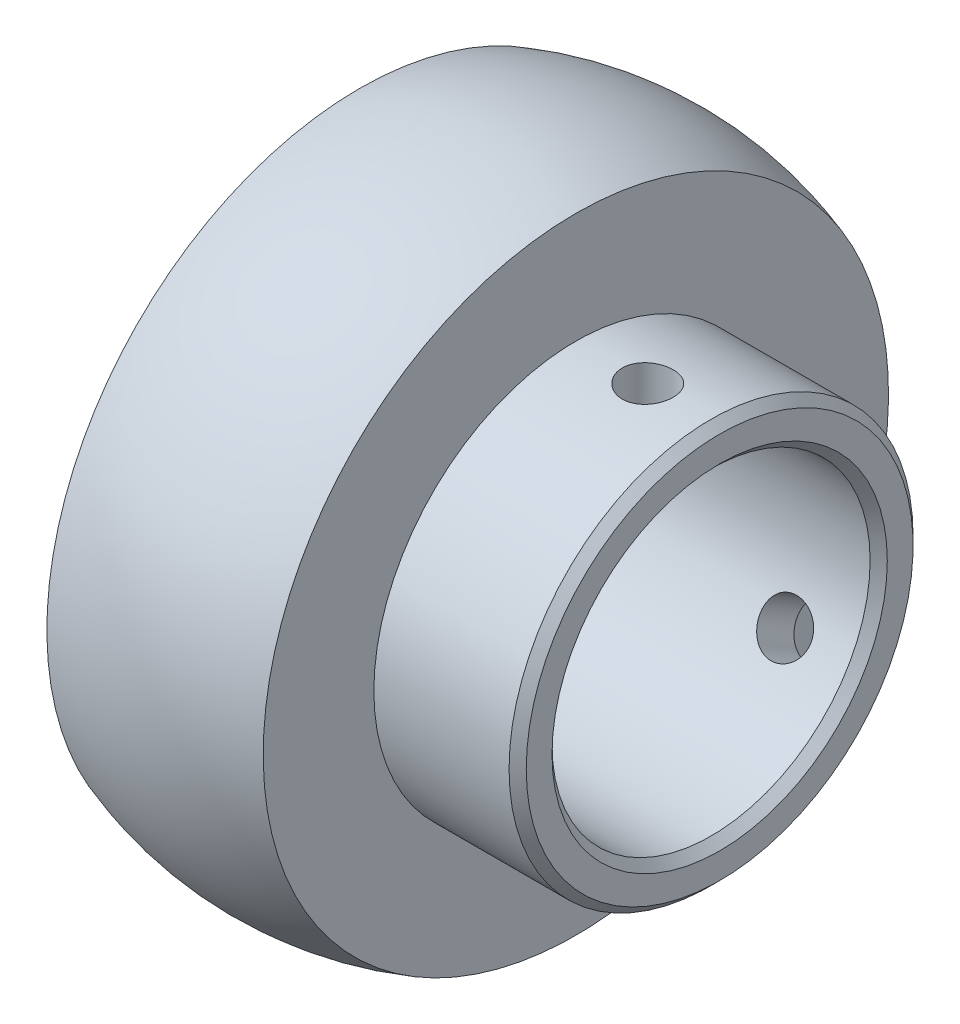
ISO-10303-21;
HEADER;
FILE_DESCRIPTION(('STEP AP214'),'2;1');
FILE_NAME('part.step','',(''),(''),'','','');
FILE_SCHEMA(('AUTOMOTIVE_DESIGN { 1 0 10303 214 1 1 1 1 }'));
ENDSEC;
DATA;
#1=APPLICATION_CONTEXT('core data for automotive mechanical design processes');
#2=APPLICATION_PROTOCOL_DEFINITION('international standard','automotive_design',2000,#1);
#3=PRODUCT_CONTEXT('',#1,'mechanical');
#4=PRODUCT('Part','Part','',(#3));
#5=PRODUCT_RELATED_PRODUCT_CATEGORY('part','',(#4));
#6=PRODUCT_DEFINITION_FORMATION('','',#4);
#7=PRODUCT_DEFINITION_CONTEXT('part definition',#1,'design');
#8=PRODUCT_DEFINITION('design','',#6,#7);
#9=PRODUCT_DEFINITION_SHAPE('','',#8);
#10=(LENGTH_UNIT() NAMED_UNIT(*) SI_UNIT(.MILLI.,.METRE.));
#11=(NAMED_UNIT(*) PLANE_ANGLE_UNIT() SI_UNIT($,.RADIAN.));
#12=(NAMED_UNIT(*) SI_UNIT($,.STERADIAN.) SOLID_ANGLE_UNIT());
#13=UNCERTAINTY_MEASURE_WITH_UNIT(LENGTH_MEASURE(1.E-05),#10,'distance_accuracy_value','');
#14=(GEOMETRIC_REPRESENTATION_CONTEXT(3) GLOBAL_UNCERTAINTY_ASSIGNED_CONTEXT((#13)) GLOBAL_UNIT_ASSIGNED_CONTEXT((#10,
#11,#12)) REPRESENTATION_CONTEXT('',''));
#15=CARTESIAN_POINT('',(0.,0.,0.));
#16=DIRECTION('',(0.,0.,1.));
#17=DIRECTION('',(1.,0.,0.));
#18=AXIS2_PLACEMENT_3D('',#15,#16,#17);
#19=CARTESIAN_POINT('',(-1000.,0.,0.));
#20=DIRECTION('',(-1.,0.,0.));
#21=DIRECTION('',(0.,0.,1.));
#22=AXIS2_PLACEMENT_3D('',#19,#20,#21);
#23=CYLINDRICAL_SURFACE('',#22,15.875);
#24=CARTESIAN_POINT('',(19.1250000000001,0.,0.));
#25=DIRECTION('',(-1.,0.,0.));
#26=DIRECTION('',(0.,0.,1.));
#27=AXIS2_PLACEMENT_3D('',#24,#25,#26);
#28=CIRCLE('',#27,15.875);
#29=CARTESIAN_POINT('',(19.1250000000001,0.,15.875));
#30=VERTEX_POINT('',#29);
#31=EDGE_CURVE('E53',#30,#30,#28,.T.);
#32=ORIENTED_EDGE('',*,*,#31,.T.);
#33=EDGE_LOOP('',(#32));
#34=FACE_BOUND('',#33,.T.);
#35=CARTESIAN_POINT('',(8.49999999999995,0.,0.));
#36=DIRECTION('',(-1.,0.,0.));
#37=DIRECTION('',(0.,0.,1.));
#38=AXIS2_PLACEMENT_3D('',#35,#36,#37);
#39=CIRCLE('',#38,15.875);
#40=CARTESIAN_POINT('',(8.49999999999995,0.,15.875));
#41=VERTEX_POINT('',#40);
#42=EDGE_CURVE('E174',#41,#41,#39,.T.);
#43=ORIENTED_EDGE('',*,*,#42,.F.);
#44=EDGE_LOOP('',(#43));
#45=FACE_BOUND('',#44,.T.);
#46=CARTESIAN_POINT('',(14.15,15.748511834456,-2.));
#47=CARTESIAN_POINT('',(14.0381384494105,15.7485134523924,-1.99999524855553));
#48=CARTESIAN_POINT('',(13.9262071639896,15.7497165319805,-1.99058357543387));
#49=CARTESIAN_POINT('',(13.7054601779164,15.7543969866903,-1.95318765248393));
#50=CARTESIAN_POINT('',(13.5966478486121,15.7578767326131,-1.92518404153693));
#51=CARTESIAN_POINT('',(13.3853667618518,15.7667102668491,-1.85144335928852));
#52=CARTESIAN_POINT('',(13.2828937338898,15.7720627770236,-1.80571838031894));
#53=CARTESIAN_POINT('',(13.0870942906262,15.7840372074871,-1.69785890210504));
#54=CARTESIAN_POINT('',(12.9937663263942,15.7906589122448,-1.63572718833439));
#55=CARTESIAN_POINT('',(12.8183569548713,15.8044677726734,-1.49643975257389));
#56=CARTESIAN_POINT('',(12.7363350370349,15.8116576278481,-1.41920937281938));
#57=CARTESIAN_POINT('',(12.5863799880055,15.8257684025693,-1.25207761624602));
#58=CARTESIAN_POINT('',(12.5184475602959,15.8326893086733,-1.16217560711322));
#59=CARTESIAN_POINT('',(12.3983862459514,15.8455100304133,-0.971878431845148));
#60=CARTESIAN_POINT('',(12.3463112313292,15.8514063367107,-0.871449020506815));
#61=CARTESIAN_POINT('',(12.2597880428856,15.861483827628,-0.663183648289304));
#62=CARTESIAN_POINT('',(12.225339204944,15.8656650768667,-0.555347966637749));
#63=CARTESIAN_POINT('',(12.1752240789684,15.871822327582,-0.335939673673915));
#64=CARTESIAN_POINT('',(12.1594588594635,15.8738099406767,-0.224389990404355));
#65=CARTESIAN_POINT('',(12.1468518632201,15.8753956248804,-0.00021178234898757));
#66=CARTESIAN_POINT('',(12.1500093309459,15.874993791394,0.112416699183834));
#67=CARTESIAN_POINT('',(12.1750788381399,15.8718552492625,0.334882227912962));
#68=CARTESIAN_POINT('',(12.1968844777027,15.8691317872949,0.444731478434195));
#69=CARTESIAN_POINT('',(12.2584649968302,15.8616708761223,0.659198925647051));
#70=CARTESIAN_POINT('',(12.2982402225595,15.8569333881195,0.763817021523035));
#71=CARTESIAN_POINT('',(12.3947438371768,15.8459539257529,0.965181562038033));
#72=CARTESIAN_POINT('',(12.4515182261247,15.8397078781804,1.06190573011397));
#73=CARTESIAN_POINT('',(12.580375082548,15.8264099980585,1.24449377001974));
#74=CARTESIAN_POINT('',(12.6524582631447,15.8193581279791,1.3303571356292));
#75=CARTESIAN_POINT('',(12.8104823372397,15.8051799073183,1.48941139298715));
#76=CARTESIAN_POINT('',(12.896515964835,15.7980533795464,1.56251016630964));
#77=CARTESIAN_POINT('',(13.0796803168561,15.7845773489401,1.6932441669862));
#78=CARTESIAN_POINT('',(13.1768110770642,15.7782278486113,1.75087934447661));
#79=CARTESIAN_POINT('',(13.3794950958505,15.767024855595,1.84905563258412));
#80=CARTESIAN_POINT('',(13.48505200393,15.7621720156096,1.88958928795802));
#81=CARTESIAN_POINT('',(13.7015489574573,15.7545244711852,1.95232983937358));
#82=CARTESIAN_POINT('',(13.812488738947,15.7517296659355,1.97453763309476));
#83=CARTESIAN_POINT('',(14.0357884646264,15.7485330768205,1.99987390904939));
#84=CARTESIAN_POINT('',(14.1481334716722,15.7481150291289,2.00313206459948));
#85=CARTESIAN_POINT('',(14.3717677431275,15.7496762675728,1.9908187933542));
#86=CARTESIAN_POINT('',(14.4830570303518,15.7516555017817,1.97524777440968));
#87=CARTESIAN_POINT('',(14.7010316905911,15.7577734487156,1.92582736892158));
#88=CARTESIAN_POINT('',(14.8077315411069,15.7619047337565,1.89204083826573));
#89=CARTESIAN_POINT('',(15.0139515611222,15.7718552621376,1.80721321308999));
#90=CARTESIAN_POINT('',(15.1134714744447,15.7776745656684,1.75617150328219));
#91=CARTESIAN_POINT('',(15.3030931029367,15.7903843738882,1.63796384277904));
#92=CARTESIAN_POINT('',(15.3931414520774,15.7972804554653,1.57071289494593));
#93=CARTESIAN_POINT('',(15.5607191543688,15.8113493175124,1.4221158475027));
#94=CARTESIAN_POINT('',(15.6382480124774,15.8185221089103,1.34076919078765));
#95=CARTESIAN_POINT('',(15.7790418620887,15.832386185117,1.16572322850878));
#96=CARTESIAN_POINT('',(15.8422216187734,15.8390744397561,1.07195509209945));
#97=CARTESIAN_POINT('',(15.9519339047026,15.8511704760989,0.875062416244103));
#98=CARTESIAN_POINT('',(15.9984667740237,15.8565782839599,0.771938067988556));
#99=CARTESIAN_POINT('',(16.0734238017248,15.865490667394,0.559542905322648));
#100=CARTESIAN_POINT('',(16.1018971240815,15.8690004062531,0.450289667150804));
#101=CARTESIAN_POINT('',(16.1400867106037,15.8737426471462,0.228505918573019));
#102=CARTESIAN_POINT('',(16.1498038346512,15.8749752535757,0.115975558647537));
#103=CARTESIAN_POINT('',(16.1501889446016,15.8750238364982,-0.108336054482698));
#104=CARTESIAN_POINT('',(16.1409883222722,15.8738564817455,-0.22011710124838));
#105=CARTESIAN_POINT('',(16.1040775134633,15.8692694583507,-0.440530726050264));
#106=CARTESIAN_POINT('',(16.0763673412841,15.8658497914489,-0.549163306518875));
#107=CARTESIAN_POINT('',(16.0032654793059,15.8571406768498,-0.760178414550271));
#108=CARTESIAN_POINT('',(15.9578801856119,15.8518519055903,-0.862563187525339));
#109=CARTESIAN_POINT('',(15.8507300216539,15.8399900350749,-1.05828412902422));
#110=CARTESIAN_POINT('',(15.7889649442034,15.8334169195738,-1.15162018307121));
#111=CARTESIAN_POINT('',(15.6503227483021,15.819665508229,-1.32726531992085));
#112=CARTESIAN_POINT('',(15.5733478855294,15.8124834793164,-1.409496962418));
#113=CARTESIAN_POINT('',(15.406674317316,15.7983535709128,-1.55992739126403));
#114=CARTESIAN_POINT('',(15.3169726036155,15.7914057472631,-1.62812285049826));
#115=CARTESIAN_POINT('',(15.1269876848541,15.7785018490831,-1.74877432119565));
#116=CARTESIAN_POINT('',(15.0266643583141,15.7725497711358,-1.80116755245359));
#117=CARTESIAN_POINT('',(14.8186239377274,15.7623581237431,-1.88828825110165));
#118=CARTESIAN_POINT('',(14.7109150171444,15.7581166958373,-1.92303490054296));
#119=CARTESIAN_POINT('',(14.5272093339912,15.7528546374031,-1.96557298626346));
#120=CARTESIAN_POINT('',(14.4523705151306,15.7512342157326,-1.97846450858597));
#121=CARTESIAN_POINT('',(14.3016984842213,15.7490622697562,-1.99567959346033));
#122=CARTESIAN_POINT('',(14.2258652798894,15.7485107371602,-2.00000322246261));
#123=CARTESIAN_POINT('',(14.15,15.748511834456,-2.));
#124=B_SPLINE_CURVE_WITH_KNOTS('',3,(#46,#47,#48,#49,#50,#51,#52,#53,#54,#55,#56,#57,#58,#59,
#60,#61,#62,#63,#64,#65,#66,#67,#68,#69,#70,#71,#72,#73,#74,#75,#76,#77,#78,#79,#80,#81,#82,#83,
#84,#85,#86,#87,#88,#89,#90,#91,#92,#93,#94,#95,#96,#97,#98,#99,#100,#101,#102,#103,#104,#105,
#106,#107,#108,#109,#110,#111,#112,#113,#114,#115,#116,#117,#118,#119,#120,#121,#122,#123),
.UNSPECIFIED.,.T.,.F.,(4,2,2,2,2,2,2,2,2,2,2,2,2,2,2,2,2,2,2,2,2,2,2,2,2,2,2,2,2,2,2,2,2,2,2,2,
2,2,4),(0.,0.335307497787281,0.670964724181042,1.00639331401727,1.3417649926233,1.6788389426269,
2.01592971856978,2.35415322700654,2.69236399089647,3.02877578039733,3.36517413790664,
3.69966583329214,4.03416397257172,4.36957557888719,4.70500281293066,5.04275878217702,
5.38051584053288,5.71841998905328,6.0563075845925,6.39188025276989,6.7274456523788,
7.06186046611993,7.39628720573523,7.73250728023294,8.068740646194,8.40692186658587,
8.74509617793433,9.08234587179594,9.41958010400552,9.75448001475644,10.0893796667669,
10.4241582409128,10.7589410498446,11.0959497112757,11.43303816494,11.7714487023612,
12.109490591772,12.3369002274259,12.5643080993407),.UNSPECIFIED.);
#125=CARTESIAN_POINT('',(14.15,15.748511834456,-2.));
#126=VERTEX_POINT('',#125);
#127=EDGE_CURVE('E104',#126,#126,#124,.T.);
#128=ORIENTED_EDGE('',*,*,#127,.F.);
#129=EDGE_LOOP('',(#128));
#130=FACE_BOUND('',#129,.T.);
#131=CARTESIAN_POINT('',(14.15,-9.60630672479692,-12.6386113204387));
#132=CARTESIAN_POINT('',(14.0381384494105,-9.60630341889354,-12.638615097335));
#133=CARTESIAN_POINT('',(13.9262071639896,-9.5987542106721,-12.6443628313819));
#134=CARTESIAN_POINT('',(13.7054601779164,-9.56870861875439,-12.6671141855368));
#135=CARTESIAN_POINT('',(13.5966478486121,-9.54619665323797,-12.6841295393781));
#136=CARTESIAN_POINT('',(13.3853667618518,-9.48675211623649,-12.728649945556));
#137=CARTESIAN_POINT('',(13.2828937338898,-9.44982937794857,-12.7561478448259));
#138=CARTESIAN_POINT('',(13.0870942906262,-9.36240754500815,-12.8204477449101));
#139=CARTESIAN_POINT('',(12.9937663263942,-9.31191075488093,-12.8572481663319));
#140=CARTESIAN_POINT('',(12.8183569548713,-9.19818872729866,-12.9388507081407));
#141=CARTESIAN_POINT('',(12.7363350370349,-9.13490018407467,-12.9836924952487));
#142=CARTESIAN_POINT('',(12.5863799880055,-8.99721522446362,-13.079478662911));
#143=CARTESIAN_POINT('',(12.5184475602959,-8.92281825375535,-13.1304233479807));
#144=CARTESIAN_POINT('',(12.3983862459514,-8.76442642657481,-13.2366750063365));
#145=CARTESIAN_POINT('',(12.3463112313292,-8.68040015821739,-13.2919960630477));
#146=CARTESIAN_POINT('',(12.2597880428856,-8.50507580060703,-13.4048561122972));
#147=CARTESIAN_POINT('',(12.225339204944,-8.41377798548173,-13.4623950211832));
#148=CARTESIAN_POINT('',(12.1752240789684,-8.22684345533171,-13.577431503202));
#149=CARTESIAN_POINT('',(12.1594588594635,-8.13123240238352,-13.6349276682697));
#150=CARTESIAN_POINT('',(12.1468518632201,-7.93788122133455,-13.7483900151002));
#151=CARTESIAN_POINT('',(12.1500093309459,-7.84014117839427,-13.8043562578593));
#152=CARTESIAN_POINT('',(12.1750788381399,-7.64591110798279,-13.9128709650072));
#153=CARTESIAN_POINT('',(12.1968844777027,-7.5494171354609,-13.9654370030176));
#154=CARTESIAN_POINT('',(12.2584649968302,-7.35995242230348,-14.0662093880132));
#155=CARTESIAN_POINT('',(12.2982402225595,-7.26698174957789,-14.1144156509906));
#156=CARTESIAN_POINT('',(12.3947438371768,-7.08710521088725,-14.2055894279188));
#157=CARTESIAN_POINT('',(12.4515182261247,-7.00021660038728,-14.2485422760856));
#158=CARTESIAN_POINT('',(12.580375082548,-6.83544177934075,-14.3283199940365));
#159=CARTESIAN_POINT('',(12.6524582631447,-6.75755598842882,-14.3651445782083));
#160=CARTESIAN_POINT('',(12.8104823372397,-6.61272185064637,-14.4323930076146));
#161=CARTESIAN_POINT('',(12.896515964835,-6.54585319207769,-14.4627706401846));
#162=CARTESIAN_POINT('',(13.0796803168561,-6.42589621105025,-14.5164670556756));
#163=CARTESIAN_POINT('',(13.1768110770642,-6.37280793302751,-14.5397858158347));
#164=CARTESIAN_POINT('',(13.3794950958505,-6.282183276969,-14.5791718833379));
#165=CARTESIAN_POINT('',(13.48505200393,-6.24465368171429,-14.5952360283171));
#166=CARTESIAN_POINT('',(13.7015489574573,-6.18649499812876,-14.6199833362767));
#167=CARTESIAN_POINT('',(13.812488738947,-6.16586508197935,-14.6286668607924));
#168=CARTESIAN_POINT('',(14.0357884646263,-6.14232492880783,-14.6385666713907));
#169=CARTESIAN_POINT('',(14.1481334716722,-6.1392942594862,-14.6398337092449));
#170=CARTESIAN_POINT('',(14.3717677431275,-6.15073848441024,-14.635029145776));
#171=CARTESIAN_POINT('',(14.4830570303518,-6.16521299948345,-14.6289577034087));
#172=CARTESIAN_POINT('',(14.7010316905911,-6.21107129956844,-14.6095457981284));
#173=CARTESIAN_POINT('',(14.8077315411069,-6.2423969359426,-14.5962303305962));
#174=CARTESIAN_POINT('',(15.0139515611222,-6.32083507847805,-14.5624339283674));
#175=CARTESIAN_POINT('',(15.1134714744447,-6.36794814758958,-14.5419527381535));
#176=CARTESIAN_POINT('',(15.3030931029367,-6.47667388861715,-14.4938559246975));
#177=CARTESIAN_POINT('',(15.3931414520774,-6.53836295865772,-14.4662026326133));
#178=CARTESIAN_POINT('',(15.5607191543688,-6.67408620769451,-14.4040881008268));
#179=CARTESIAN_POINT('',(15.6382480124774,-6.74812087462159,-14.3696265920359));
#180=CARTESIAN_POINT('',(15.7790418620887,-6.90664716288837,-14.2941102530915));
#181=CARTESIAN_POINT('',(15.8422216187734,-6.9911968784039,-14.2530183833113));
#182=CARTESIAN_POINT('',(15.9519339047026,-7.16775895568514,-14.1650475201415));
#183=CARTESIAN_POINT('',(15.9984667740237,-7.25977116495366,-14.1181686450002));
#184=CARTESIAN_POINT('',(16.0734238017248,-7.44816696318029,-14.0196894141294));
#185=CARTESIAN_POINT('',(16.1018971240815,-7.54453791231237,-13.9681023180561));
#186=CARTESIAN_POINT('',(16.1400867106037,-7.73897939317382,-13.8613173448515));
#187=CARTESIAN_POINT('',(16.1498038346512,-7.83704984678106,-13.8061196333696));
#188=CARTESIAN_POINT('',(16.1501889446016,-8.03133369357695,-13.6940059008495));
#189=CARTESIAN_POINT('',(16.1409883222722,-8.12755524236128,-13.6371044185956));
#190=CARTESIAN_POINT('',(16.1040775134633,-8.31614552908257,-13.5229251274071));
#191=CARTESIAN_POINT('',(16.0763673412841,-8.40851426999612,-13.4656473187633));
#192=CARTESIAN_POINT('',(16.0032654793059,-8.58690415683407,-13.3525974502603));
#193=CARTESIAN_POINT('',(15.9578801856119,-8.67292758556142,-13.2968248535072));
#194=CARTESIAN_POINT('',(15.8507300216539,-8.83649595769439,-13.1886917015551));
#195=CARTESIAN_POINT('',(15.7889649442034,-8.91404079383754,-13.1363311895257));
#196=CARTESIAN_POINT('',(15.6503227483021,-9.05927823872809,-13.0365995495383));
#197=CARTESIAN_POINT('',(15.5733478855294,-9.12690191566926,-12.9892639088007));
#198=CARTESIAN_POINT('',(15.406674317316,-9.25011353435032,-12.9018118347471));
#199=CARTESIAN_POINT('',(15.3169726036155,-9.30569862264504,-12.8616971133483));
#200=CARTESIAN_POINT('',(15.1269876848541,-9.40373391218295,-12.7901962743679));
#201=CARTESIAN_POINT('',(15.0266643583141,-9.44613174246502,-12.7588450080312));
#202=CARTESIAN_POINT('',(14.8186239377274,-9.51648465699334,-12.7064584331587));
#203=CARTESIAN_POINT('',(14.7109150171444,-9.54445542415301,-12.6854119241233));
#204=CARTESIAN_POINT('',(14.5272093339912,-9.57866345779823,-12.6595858049829));
#205=CARTESIAN_POINT('',(14.4523705151306,-9.58901763278771,-12.6517367174901));
#206=CARTESIAN_POINT('',(14.3016984842213,-9.60284036062899,-12.6412482146616));
#207=CARTESIAN_POINT('',(14.2258652798894,-9.60630896688354,-12.6386087589214));
#208=CARTESIAN_POINT('',(14.15,-9.60630672479692,-12.6386113204387));
#209=B_SPLINE_CURVE_WITH_KNOTS('',3,(#131,#132,#133,#134,#135,#136,#137,#138,#139,#140,#141,
#142,#143,#144,#145,#146,#147,#148,#149,#150,#151,#152,#153,#154,#155,#156,#157,#158,#159,#160,
#161,#162,#163,#164,#165,#166,#167,#168,#169,#170,#171,#172,#173,#174,#175,#176,#177,#178,#179,
#180,#181,#182,#183,#184,#185,#186,#187,#188,#189,#190,#191,#192,#193,#194,#195,#196,#197,#198,
#199,#200,#201,#202,#203,#204,#205,#206,#207,#208),.UNSPECIFIED.,.T.,.F.,(4,2,2,2,2,2,2,2,2,2,2,
2,2,2,2,2,2,2,2,2,2,2,2,2,2,2,2,2,2,2,2,2,2,2,2,2,2,2,4),(0.,0.335307497787283,0.67096472418104,
1.00639331401726,1.3417649926233,1.67883894262689,2.01592971856978,2.35415322700654,
2.69236399089646,3.02877578039733,3.36517413790664,3.69966583329213,4.03416397257172,
4.36957557888719,4.70500281293066,5.04275878217702,5.38051584053287,5.71841998905327,
6.05630758459249,6.39188025276988,6.7274456523788,7.06186046611993,7.39628720573523,
7.73250728023294,8.068740646194,8.40692186658587,8.74509617793433,9.08234587179594,
9.41958010400552,9.75448001475644,10.0893796667669,10.4241582409128,10.7589410498446,
11.0959497112757,11.43303816494,11.7714487023612,12.109490591772,12.3369002274259,
12.5643080993407),.UNSPECIFIED.);
#210=CARTESIAN_POINT('',(14.15,-9.60630672479692,-12.6386113204387));
#211=VERTEX_POINT('',#210);
#212=EDGE_CURVE('E79',#211,#211,#209,.T.);
#213=ORIENTED_EDGE('',*,*,#212,.F.);
#214=EDGE_LOOP('',(#213));
#215=FACE_BOUND('',#214,.T.);
#216=ADVANCED_FACE('F37',(#34,#45,#130,#215),#23,.T.);
#217=CARTESIAN_POINT('',(-1000.,0.,0.));
#218=DIRECTION('',(-1.,0.,0.));
#219=DIRECTION('',(0.,0.,1.));
#220=AXIS2_PLACEMENT_3D('',#217,#218,#219);
#221=CYLINDRICAL_SURFACE('',#220,12.5);
#222=CARTESIAN_POINT('',(19.1250000000001,0.,0.));
#223=DIRECTION('',(-1.,0.,0.));
#224=DIRECTION('',(0.,0.,1.));
#225=AXIS2_PLACEMENT_3D('',#222,#223,#224);
#226=CIRCLE('',#225,12.5);
#227=CARTESIAN_POINT('',(19.1250000000001,0.,12.5));
#228=VERTEX_POINT('',#227);
#229=EDGE_CURVE('E58',#228,#228,#226,.F.);
#230=ORIENTED_EDGE('',*,*,#229,.T.);
#231=EDGE_LOOP('',(#230));
#232=FACE_BOUND('',#231,.T.);
#233=CARTESIAN_POINT('',(-13.6249999999999,0.,0.));
#234=DIRECTION('',(1.,0.,0.));
#235=DIRECTION('',(0.,0.,-1.));
#236=AXIS2_PLACEMENT_3D('',#233,#234,#235);
#237=CIRCLE('',#236,12.5);
#238=CARTESIAN_POINT('',(-13.6249999999999,0.,-12.5));
#239=VERTEX_POINT('',#238);
#240=EDGE_CURVE('E61',#239,#239,#237,.F.);
#241=ORIENTED_EDGE('',*,*,#240,.T.);
#242=EDGE_LOOP('',(#241));
#243=FACE_BOUND('',#242,.T.);
#244=CARTESIAN_POINT('',(14.15,12.3389626792531,-2.));
#245=CARTESIAN_POINT('',(14.2615667153696,12.3389646365747,-1.99999546268269));
#246=CARTESIAN_POINT('',(14.3731959408764,12.3404922170901,-1.99063305520351));
#247=CARTESIAN_POINT('',(14.5933268473446,12.3464325117521,-1.95344445500885));
#248=CARTESIAN_POINT('',(14.7018254745046,12.3508479497636,-1.92560083019994));
#249=CARTESIAN_POINT('',(14.9124773131013,12.3620513503607,-1.85230972937127));
#250=CARTESIAN_POINT('',(15.0146355716453,12.3688373965941,-1.8068764692589));
#251=CARTESIAN_POINT('',(15.2098664803884,12.3840151290006,-1.6997304164843));
#252=CARTESIAN_POINT('',(15.3029402449359,12.3924066178675,-1.63801962395042));
#253=CARTESIAN_POINT('',(15.4782189327953,12.409935008592,-1.49947140236479));
#254=CARTESIAN_POINT('',(15.5603292655098,12.4190774196954,-1.42251498707584));
#255=CARTESIAN_POINT('',(15.7105294596601,12.4370285016078,-1.25591709815231));
#256=CARTESIAN_POINT('',(15.7786185153008,12.4458371532121,-1.16627489597168));
#257=CARTESIAN_POINT('',(15.8991959612917,12.4621862608068,-0.976239917029315));
#258=CARTESIAN_POINT('',(15.9515966903381,12.4697194921289,-0.875790844473842));
#259=CARTESIAN_POINT('',(16.03874693906,12.4826077762261,-0.667375995890956));
#260=CARTESIAN_POINT('',(16.0734975174907,12.4879629596488,-0.559410671172463));
#261=CARTESIAN_POINT('',(16.1240727443624,12.4958528816707,-0.340004128946066));
#262=CARTESIAN_POINT('',(16.1400561194051,12.49841126176,-0.228600363359406));
#263=CARTESIAN_POINT('',(16.1531365080857,12.500500461766,-0.00466480752225047));
#264=CARTESIAN_POINT('',(16.1502347091449,12.5000314720312,0.107866911363012));
#265=CARTESIAN_POINT('',(16.125751514315,12.4961375614702,0.329779715978532));
#266=CARTESIAN_POINT('',(16.1043409157527,12.4927396690852,0.439180187321415));
#267=CARTESIAN_POINT('',(16.0437164853754,12.4833998597574,0.652815342747674));
#268=CARTESIAN_POINT('',(16.0045021451906,12.4774578701704,0.757049879228182));
#269=CARTESIAN_POINT('',(15.9092115412999,12.4636513003451,0.957905986409039));
#270=CARTESIAN_POINT('',(15.8530642726042,12.4557786507463,1.05449329349384));
#271=CARTESIAN_POINT('',(15.725553571383,12.4389865614945,1.23693967157033));
#272=CARTESIAN_POINT('',(15.6541890018292,12.4300670436423,1.32279794013346));
#273=CARTESIAN_POINT('',(15.4973204364398,12.4120565702159,1.48235721573536));
#274=CARTESIAN_POINT('',(15.4116672241591,12.4029648129688,1.555911508216));
#275=CARTESIAN_POINT('',(15.2291572437281,12.3857313850728,1.68762680827441));
#276=CARTESIAN_POINT('',(15.1323003873106,12.3775897219101,1.74578769456446));
#277=CARTESIAN_POINT('',(14.929969490043,12.3631781549851,1.84509031627292));
#278=CARTESIAN_POINT('',(14.8244871648436,12.3569100782548,1.88621545421918));
#279=CARTESIAN_POINT('',(14.6079893783567,12.3469864391895,1.95012354011945));
#280=CARTESIAN_POINT('',(14.4969743646357,12.343330665898,1.9729079691951));
#281=CARTESIAN_POINT('',(14.2738721773265,12.3390860491727,1.99928349997629));
#282=CARTESIAN_POINT('',(14.1618102853156,12.338463865144,2.0030832637492));
#283=CARTESIAN_POINT('',(13.9386510337344,12.3402681873056,1.99193667548245));
#284=CARTESIAN_POINT('',(13.8275536400875,12.3426945853421,1.97699098847046));
#285=CARTESIAN_POINT('',(13.6101330945556,12.3502919469979,1.92895527704861));
#286=CARTESIAN_POINT('',(13.5037860768192,12.3554469800096,1.89597053344241));
#287=CARTESIAN_POINT('',(13.2981296129833,12.3679074973821,1.81290306911356));
#288=CARTESIAN_POINT('',(13.1988205583181,12.3752131012361,1.76281939829005));
#289=CARTESIAN_POINT('',(13.0091276069185,12.3912295180301,1.64647965217412));
#290=CARTESIAN_POINT('',(12.9188270464299,12.3999517832886,1.58008930093855));
#291=CARTESIAN_POINT('',(12.7505739393633,12.4177848415153,1.43320604247695));
#292=CARTESIAN_POINT('',(12.67262219136,12.426895659562,1.35271222391416));
#293=CARTESIAN_POINT('',(12.5305227079071,12.4445842082074,1.17898475488122));
#294=CARTESIAN_POINT('',(12.4665137708892,12.4531560233311,1.08563688229299));
#295=CARTESIAN_POINT('',(12.3550869540115,12.4687070996718,0.889391847388555));
#296=CARTESIAN_POINT('',(12.3076685706772,12.4756864092145,0.786494974976323));
#297=CARTESIAN_POINT('',(12.2309872759813,12.4872402999743,0.574493777094338));
#298=CARTESIAN_POINT('',(12.201650393764,12.491824666927,0.465416763098577));
#299=CARTESIAN_POINT('',(12.1617261636075,12.4981133908354,0.243805255219825));
#300=CARTESIAN_POINT('',(12.151137398846,12.4998179654206,0.131271023257729));
#301=CARTESIAN_POINT('',(12.1490482019207,12.5001523384762,-0.0927181607457137));
#302=CARTESIAN_POINT('',(12.1573361005971,12.4988162330541,-0.204171144782977));
#303=CARTESIAN_POINT('',(12.1923088382718,12.4932886224694,-0.424076331137224));
#304=CARTESIAN_POINT('',(12.2189935933506,12.4890971303321,-0.532528547140257));
#305=CARTESIAN_POINT('',(12.2899238248278,12.4783277894448,-0.743282123112947));
#306=CARTESIAN_POINT('',(12.3341526720481,12.471752200968,-0.845589202324676));
#307=CARTESIAN_POINT('',(12.4388924603789,12.4569342995937,-1.0413631983055));
#308=CARTESIAN_POINT('',(12.4994040744622,12.4486919178104,-1.13482974947654));
#309=CARTESIAN_POINT('',(12.6357483203844,12.4313454639236,-1.31133889146831));
#310=CARTESIAN_POINT('',(12.7117365029865,12.4222331866072,-1.39426053318836));
#311=CARTESIAN_POINT('',(12.8765498688637,12.4042323453373,-1.54625119082762));
#312=CARTESIAN_POINT('',(12.9653780557212,12.3953438343009,-1.61531695647598));
#313=CARTESIAN_POINT('',(13.154029173919,12.3787350502446,-1.73804191736152));
#314=CARTESIAN_POINT('',(13.2539194502565,12.3710226983478,-1.79159866107389));
#315=CARTESIAN_POINT('',(13.4613582896633,12.35773272045,-1.88109182389773));
#316=CARTESIAN_POINT('',(13.5688989515412,12.3521529288763,-1.91704612842095));
#317=CARTESIAN_POINT('',(13.7557379581206,12.3450187006154,-1.96235985662764));
#318=CARTESIAN_POINT('',(13.8338952934715,12.3427600761638,-1.97645270113688));
#319=CARTESIAN_POINT('',(13.9913578945606,12.339731381368,-1.99527431170452));
#320=CARTESIAN_POINT('',(14.0706631420381,12.3389612873707,-2.00000322655819));
#321=CARTESIAN_POINT('',(14.15,12.3389626792531,-2.));
#322=B_SPLINE_CURVE_WITH_KNOTS('',3,(#244,#245,#246,#247,#248,#249,#250,#251,#252,#253,#254,
#255,#256,#257,#258,#259,#260,#261,#262,#263,#264,#265,#266,#267,#268,#269,#270,#271,#272,#273,
#274,#275,#276,#277,#278,#279,#280,#281,#282,#283,#284,#285,#286,#287,#288,#289,#290,#291,#292,
#293,#294,#295,#296,#297,#298,#299,#300,#301,#302,#303,#304,#305,#306,#307,#308,#309,#310,#311,
#312,#313,#314,#315,#316,#317,#318,#319,#320,#321),.UNSPECIFIED.,.T.,.F.,(4,2,2,2,2,2,2,2,2,2,2,
2,2,2,2,2,2,2,2,2,2,2,2,2,2,2,2,2,2,2,2,2,2,2,2,2,2,2,4),(0.,0.334410082462097,0.66913604063283,
1.00359203680449,1.33800695527949,1.6751426933581,2.01229780104021,2.35130309503299,
2.69028805118043,3.02638485112864,3.36246051891023,3.69546762348862,4.0284842373816,
4.3629171817807,4.69737512358616,5.03557384337791,5.37377522782555,5.71230534220323,
6.05080811551122,6.3855820633356,6.72034413480417,7.05317297710996,7.38602031604106,
7.7217061792982,8.05741374188326,8.39632425403564,8.73522448035855,9.07272891067331,
9.41020783420237,9.74392117047707,10.0776329844847,10.4110292424998,10.7444392820194,
11.0813822106389,11.4184040861632,11.7576040091322,12.0964585602663,12.3342666441618,
12.5720709491951),.UNSPECIFIED.);
#323=CARTESIAN_POINT('',(14.15,12.3389626792531,-2.));
#324=VERTEX_POINT('',#323);
#325=EDGE_CURVE('E80',#324,#324,#322,.T.);
#326=ORIENTED_EDGE('',*,*,#325,.F.);
#327=EDGE_LOOP('',(#326));
#328=FACE_BOUND('',#327,.T.);
#329=CARTESIAN_POINT('',(14.15,-7.90153214719545,-9.68585513658122));
#330=CARTESIAN_POINT('',(14.2615667153696,-7.90152919642421,-9.68585910033011));
#331=CARTESIAN_POINT('',(14.3731959408764,-7.89418490396436,-9.69186322760237));
#332=CARTESIAN_POINT('',(14.5933268473446,-7.86494877879563,-9.71560197378301));
#333=CARTESIAN_POINT('',(14.7018254745046,-7.84304321138339,-9.73334766767421));
#334=CARTESIAN_POINT('',(14.9124773131013,-7.785172956493,-9.77969564761443));
#335=CARTESIAN_POINT('',(15.0146355716453,-7.74921962217565,-9.80828916610001));
#336=CARTESIAN_POINT('',(15.2098664803884,-7.66401728476086,-9.87500649432316));
#337=CARTESIAN_POINT('',(15.3029402449359,-7.61476991517231,-9.91312913312442));
#338=CARTESIAN_POINT('',(15.4782189327953,-7.50354783099224,-9.99758327557211));
#339=CARTESIAN_POINT('',(15.5603292655098,-7.44147282591953,-10.043979043484));
#340=CARTESIAN_POINT('',(15.7105294596601,-7.30617036285109,-10.1428240809073));
#341=CARTESIAN_POINT('',(15.7786185153008,-7.23294226431363,-10.19527369806));
#342=CARTESIAN_POINT('',(15.8991959612917,-7.07654169873923,-10.3044499300374));
#343=CARTESIAN_POINT('',(15.9515966903381,-6.99331686578066,-10.3611984360126));
#344=CARTESIAN_POINT('',(16.03874693906,-6.81926845443059,-10.4765674417434));
#345=CARTESIAN_POINT('',(16.0734975174907,-6.72844533220793,-10.5351878289887));
#346=CARTESIAN_POINT('',(16.1240727443624,-6.5423786538943,-10.6517239730067));
#347=CARTESIAN_POINT('',(16.1400561194051,-6.44717935286363,-10.7096414779499));
#348=CARTESIAN_POINT('',(16.1531365080857,-6.25429007270107,-10.8234185561473));
#349=CARTESIAN_POINT('',(16.1502347091449,-6.15660025054751,-10.8792782585655));
#350=CARTESIAN_POINT('',(16.125751514315,-5.96247116904493,-10.9868624354074));
#351=CARTESIAN_POINT('',(16.1043409157527,-5.86602863548349,-11.038620009954));
#352=CARTESIAN_POINT('',(16.0437164853754,-5.676345259079,-11.1373490755228));
#353=CARTESIAN_POINT('',(16.0045021451906,-5.58310450774173,-11.1843204298317));
#354=CARTESIAN_POINT('',(15.9092115412999,-5.40225473150516,-11.2727916432143));
#355=CARTESIAN_POINT('',(15.8530642726042,-5.31467134508724,-11.3142673822091));
#356=CARTESIAN_POINT('',(15.725553571383,-5.1482721022186,-11.3909481953726));
#357=CARTESIAN_POINT('',(15.6541890018292,-5.0694569015919,-11.4261528006047));
#358=CARTESIAN_POINT('',(15.4973204364398,-4.922269278798,-11.4903349108842));
#359=CARTESIAN_POINT('',(15.4116672241591,-4.85402351432883,-11.5192383643834));
#360=CARTESIAN_POINT('',(15.2291572437281,-4.73133800446316,-11.5701714280604));
#361=CARTESIAN_POINT('',(15.1323003873106,-4.67689836784803,-11.5922009840776));
#362=CARTESIAN_POINT('',(14.929969490043,-4.5836939913236,-11.6293715118664));
#363=CARTESIAN_POINT('',(14.8244871648436,-4.54494453876285,-11.6445057671582));
#364=CARTESIAN_POINT('',(14.6079893783567,-4.48463669333331,-11.6678656865798));
#365=CARTESIAN_POINT('',(14.4969743646357,-4.46307691229732,-11.6760919085767));
#366=CARTESIAN_POINT('',(14.2738721773265,-4.43811272423987,-11.6856037280538));
#367=CARTESIAN_POINT('',(14.1618102853156,-4.4345109402698,-11.6869647827656));
#368=CARTESIAN_POINT('',(13.9386510337344,-4.44506632995514,-11.6829540774608));
#369=CARTESIAN_POINT('',(13.8275536400875,-4.4592228736028,-11.6775825562941));
#370=CARTESIAN_POINT('',(13.6101330945556,-4.50462170081088,-11.6601442087789));
#371=CARTESIAN_POINT('',(13.5037860768192,-4.53576484321702,-11.6481162265213));
#372=CARTESIAN_POINT('',(13.2981296129833,-4.61393363623998,-11.6173736189457));
#373=CARTESIAN_POINT('',(13.1988205583181,-4.66096016941491,-11.5986586220614));
#374=CARTESIAN_POINT('',(13.0091276069185,-4.76972155341813,-11.5543593728247));
#375=CARTESIAN_POINT('',(12.9188270464299,-4.83157841678359,-11.5287179004994));
#376=CARTESIAN_POINT('',(12.7505739393633,-4.9676995791153,-11.47072015272));
#377=CARTESIAN_POINT('',(12.67262219136,-5.04196467986166,-11.4383634433164));
#378=CARTESIAN_POINT('',(12.5305227079071,-5.20126135570205,-11.3668184412828));
#379=CARTESIAN_POINT('',(12.4665137708892,-5.28638889231454,-11.3275679146424));
#380=CARTESIAN_POINT('',(12.3550869540115,-5.46411761607872,-11.2429130243575));
#381=CARTESIAN_POINT('',(12.3076685706772,-5.55671857632899,-11.1975088475161));
#382=CARTESIAN_POINT('',(12.2309872759813,-5.74609394470742,-11.1015142114857));
#383=CARTESIAN_POINT('',(12.201650393764,-5.84284959327309,-11.0509458827292));
#384=CARTESIAN_POINT('',(12.1617261636075,-6.03791515082124,-10.9455863234518));
#385=CARTESIAN_POINT('',(12.151137398846,-6.13622494178839,-10.8907954123642));
#386=CARTESIAN_POINT('',(12.1490482019207,-6.33037245183611,-10.779090395923));
#387=CARTESIAN_POINT('',(12.1573361005971,-6.42622551462892,-10.7222068026667));
#388=CARTESIAN_POINT('',(12.1923088382718,-6.61390518714331,-10.607467158301));
#389=CARTESIAN_POINT('',(12.2189935933506,-6.70573181522997,-10.5496111116287));
#390=CARTESIAN_POINT('',(12.2899238248278,-6.88286509551711,-10.434907800852));
#391=CARTESIAN_POINT('',(12.3341526720481,-6.96817783086304,-10.3780596345804));
#392=CARTESIAN_POINT('',(12.4388924603789,-7.13031413409565,-10.267339957569));
#393=CARTESIAN_POINT('',(12.4994040744622,-7.20713735092229,-10.2134685699716));
#394=CARTESIAN_POINT('',(12.6357483203844,-7.35132552494392,-10.1101915292441));
#395=CARTESIAN_POINT('',(12.7117365029865,-7.41858163453882,-10.0608392447418));
#396=CARTESIAN_POINT('',(12.8765498688637,-7.54120898455737,-9.9692547300929));
#397=CARTESIAN_POINT('',(12.9653780557212,-7.59657743662244,-9.92702417090933));
#398=CARTESIAN_POINT('',(13.154029173919,-7.69455597839964,-9.85127806154788));
#399=CARTESIAN_POINT('',(13.2539194502565,-7.73708130305014,-9.81782059702617));
#400=CARTESIAN_POINT('',(13.4613582896633,-7.8079396665717,-9.76156455713901));
#401=CARTESIAN_POINT('',(13.5688989515412,-7.83628711187733,-9.73875516362669));
#402=CARTESIAN_POINT('',(13.7557379581206,-7.87196283751406,-9.70991987661303));
#403=CARTESIAN_POINT('',(13.8338952934715,-7.88303828664485,-9.70091742820573));
#404=CARTESIAN_POINT('',(13.9913578945606,-7.89782393213868,-9.68888369628844));
#405=CARTESIAN_POINT('',(14.0706631420381,-7.90153424553562,-9.68585231789661));
#406=CARTESIAN_POINT('',(14.15,-7.90153214719545,-9.68585513658122));
#407=B_SPLINE_CURVE_WITH_KNOTS('',3,(#329,#330,#331,#332,#333,#334,#335,#336,#337,#338,#339,
#340,#341,#342,#343,#344,#345,#346,#347,#348,#349,#350,#351,#352,#353,#354,#355,#356,#357,#358,
#359,#360,#361,#362,#363,#364,#365,#366,#367,#368,#369,#370,#371,#372,#373,#374,#375,#376,#377,
#378,#379,#380,#381,#382,#383,#384,#385,#386,#387,#388,#389,#390,#391,#392,#393,#394,#395,#396,
#397,#398,#399,#400,#401,#402,#403,#404,#405,#406),.UNSPECIFIED.,.T.,.F.,(4,2,2,2,2,2,2,2,2,2,2,
2,2,2,2,2,2,2,2,2,2,2,2,2,2,2,2,2,2,2,2,2,2,2,2,2,2,2,4),(0.,0.334410082462097,0.66913604063283,
1.00359203680449,1.33800695527949,1.6751426933581,2.01229780104021,2.35130309503299,
2.69028805118043,3.02638485112865,3.36246051891023,3.69546762348862,4.0284842373816,
4.3629171817807,4.69737512358616,5.03557384337791,5.37377522782555,5.71230534220323,
6.05080811551122,6.3855820633356,6.72034413480417,7.05317297710996,7.38602031604106,
7.7217061792982,8.05741374188326,8.39632425403564,8.73522448035856,9.07272891067331,
9.41020783420237,9.74392117047707,10.0776329844847,10.4110292424998,10.7444392820194,
11.0813822106389,11.4184040861632,11.7576040091322,12.0964585602663,12.3342666441617,
12.5720709491951),.UNSPECIFIED.);
#408=CARTESIAN_POINT('',(14.15,-7.90153214719545,-9.68585513658122));
#409=VERTEX_POINT('',#408);
#410=EDGE_CURVE('E71',#409,#409,#407,.T.);
#411=ORIENTED_EDGE('',*,*,#410,.F.);
#412=EDGE_LOOP('',(#411));
#413=FACE_BOUND('',#412,.T.);
#414=ADVANCED_FACE('F86',(#232,#243,#328,#413),#221,.F.);
#415=CARTESIAN_POINT('',(-14.3,12.5,0.));
#416=DIRECTION('',(1.,0.,0.));
#417=DIRECTION('',(0.,0.,-1.));
#418=AXIS2_PLACEMENT_3D('',#415,#416,#417);
#419=PLANE('',#418);
#420=CARTESIAN_POINT('',(-14.3,0.,0.));
#421=DIRECTION('',(1.,0.,0.));
#422=DIRECTION('',(0.,0.,-1.));
#423=AXIS2_PLACEMENT_3D('',#420,#421,#422);
#424=CIRCLE('',#423,15.2);
#425=CARTESIAN_POINT('',(-14.3,0.,-15.2));
#426=VERTEX_POINT('',#425);
#427=EDGE_CURVE('E45',#426,#426,#424,.F.);
#428=ORIENTED_EDGE('',*,*,#427,.T.);
#429=EDGE_LOOP('',(#428));
#430=FACE_BOUND('',#429,.T.);
#431=CARTESIAN_POINT('',(-14.3,0.,0.));
#432=DIRECTION('',(1.,0.,0.));
#433=DIRECTION('',(0.,0.,-1.));
#434=AXIS2_PLACEMENT_3D('',#431,#432,#433);
#435=CIRCLE('',#434,13.1750000000001);
#436=CARTESIAN_POINT('',(-14.3,0.,-13.1750000000001));
#437=VERTEX_POINT('',#436);
#438=EDGE_CURVE('E49',#437,#437,#435,.T.);
#439=ORIENTED_EDGE('',*,*,#438,.T.);
#440=EDGE_LOOP('',(#439));
#441=FACE_BOUND('',#440,.T.);
#442=ADVANCED_FACE('F130',(#430,#441),#419,.F.);
#443=CARTESIAN_POINT('',(-1000.,0.,0.));
#444=DIRECTION('',(-1.,0.,0.));
#445=DIRECTION('',(0.,0.,1.));
#446=AXIS2_PLACEMENT_3D('',#443,#444,#445);
#447=CYLINDRICAL_SURFACE('',#446,15.875);
#448=CARTESIAN_POINT('',(-13.625,0.,0.));
#449=DIRECTION('',(1.,0.,0.));
#450=DIRECTION('',(0.,0.,-1.));
#451=AXIS2_PLACEMENT_3D('',#448,#449,#450);
#452=CIRCLE('',#451,15.875);
#453=CARTESIAN_POINT('',(-13.625,0.,-15.875));
#454=VERTEX_POINT('',#453);
#455=EDGE_CURVE('E10',#454,#454,#452,.T.);
#456=ORIENTED_EDGE('',*,*,#455,.T.);
#457=EDGE_LOOP('',(#456));
#458=FACE_BOUND('',#457,.T.);
#459=CARTESIAN_POINT('',(-8.49999999999995,0.,0.));
#460=DIRECTION('',(-1.,0.,0.));
#461=DIRECTION('',(0.,0.,1.));
#462=AXIS2_PLACEMENT_3D('',#459,#460,#461);
#463=CIRCLE('',#462,15.875);
#464=CARTESIAN_POINT('',(-8.49999999999995,0.,15.875));
#465=VERTEX_POINT('',#464);
#466=EDGE_CURVE('E70',#465,#465,#463,.T.);
#467=ORIENTED_EDGE('',*,*,#466,.T.);
#468=EDGE_LOOP('',(#467));
#469=FACE_BOUND('',#468,.T.);
#470=ADVANCED_FACE('F126',(#458,#469),#447,.T.);
#471=CARTESIAN_POINT('',(-8.5,24.5713247506112,0.));
#472=DIRECTION('',(1.,0.,0.));
#473=DIRECTION('',(0.,0.,-1.));
#474=AXIS2_PLACEMENT_3D('',#471,#472,#473);
#475=PLANE('',#474);
#476=ORIENTED_EDGE('',*,*,#466,.F.);
#477=EDGE_LOOP('',(#476));
#478=FACE_BOUND('',#477,.T.);
#479=CARTESIAN_POINT('',(-8.49999999999995,0.,0.));
#480=DIRECTION('',(-1.,0.,0.));
#481=DIRECTION('',(0.,0.,1.));
#482=AXIS2_PLACEMENT_3D('',#479,#480,#481);
#483=CIRCLE('',#482,24.5713247506112);
#484=CARTESIAN_POINT('',(-8.49999999999995,24.5713247506112,0.));
#485=VERTEX_POINT('',#484);
#486=EDGE_CURVE('E182',#485,#485,#483,.T.);
#487=ORIENTED_EDGE('',*,*,#486,.T.);
#488=EDGE_LOOP('',(#487));
#489=FACE_BOUND('',#488,.T.);
#490=ADVANCED_FACE('F122',(#478,#489),#475,.F.);
#491=CARTESIAN_POINT('',(0.,0.,0.));
#492=DIRECTION('',(-1.,0.,0.));
#493=DIRECTION('',(0.,1.,0.));
#494=AXIS2_PLACEMENT_3D('',#491,#492,#493);
#495=SPHERICAL_SURFACE('',#494,26.);
#496=CARTESIAN_POINT('',(8.49999999999995,0.,0.));
#497=DIRECTION('',(-1.,0.,0.));
#498=DIRECTION('',(0.,0.,1.));
#499=AXIS2_PLACEMENT_3D('',#496,#497,#498);
#500=CIRCLE('',#499,24.5713247506112);
#501=CARTESIAN_POINT('',(8.49999999999995,24.5713247506112,0.));
#502=VERTEX_POINT('',#501);
#503=EDGE_CURVE('E178',#502,#502,#500,.T.);
#504=CARTESIAN_POINT('',(-8.49999999999995,24.5713247506112,0.));
#505=CARTESIAN_POINT('',(-8.32951302500968,24.6303019077721,0.));
#506=CARTESIAN_POINT('',(-8.15841205966526,24.6875041437312,0.));
#507=CARTESIAN_POINT('',(-7.81505667428851,24.7983352106276,0.));
#508=CARTESIAN_POINT('',(-7.64280225425619,24.8519640415649,0.));
#509=CARTESIAN_POINT('',(-7.29721448552407,24.9556247358,0.));
#510=CARTESIAN_POINT('',(-7.12388113682428,25.0056565990976,0.));
#511=CARTESIAN_POINT('',(-6.77621063814621,25.102101768718,0.));
#512=CARTESIAN_POINT('',(-6.60187348816795,25.1485150750407,0.));
#513=CARTESIAN_POINT('',(-6.2522709133524,25.2377029980084,0.));
#514=CARTESIAN_POINT('',(-6.07700548851512,25.2804776146534,0.));
#515=CARTESIAN_POINT('',(-5.72562230220317,25.3623696318607,0.));
#516=CARTESIAN_POINT('',(-5.5495045407285,25.401487032423,0.));
#517=CARTESIAN_POINT('',(-5.19649298607403,25.4760476676188,0.));
#518=CARTESIAN_POINT('',(-5.01959919289423,25.5114909022524,0.));
#519=CARTESIAN_POINT('',(-4.66511221667858,25.578687849767,0.));
#520=CARTESIAN_POINT('',(-4.48751903364274,25.610441562648,0.));
#521=CARTESIAN_POINT('',(-4.13171022239954,25.6702457087974,0.));
#522=CARTESIAN_POINT('',(-3.95349459419219,25.6982961420658,0.));
#523=CARTESIAN_POINT('',(-3.59651810702313,25.7506815757809,0.));
#524=CARTESIAN_POINT('',(-3.41775724806143,25.7750165762276,0.));
#525=CARTESIAN_POINT('',(-3.05976775001636,25.8199606008124,0.));
#526=CARTESIAN_POINT('',(-2.88053911093299,25.8405696249504,0.));
#527=CARTESIAN_POINT('',(-2.52169170595313,25.8780527677728,0.));
#528=CARTESIAN_POINT('',(-2.34207294005663,25.8949268864572,0.));
#529=CARTESIAN_POINT('',(-1.98252310378595,25.9249329074247,0.));
#530=CARTESIAN_POINT('',(-1.80259203341177,25.9380648097077,0.));
#531=CARTESIAN_POINT('',(-1.4424955458317,25.9605807082925,0.));
#532=CARTESIAN_POINT('',(-1.26233012862581,25.9699647045944,0.));
#533=CARTESIAN_POINT('',(-0.901843006562268,25.9849807254696,0.));
#534=CARTESIAN_POINT('',(-0.721521301704614,25.9906127500431,0.));
#535=CARTESIAN_POINT('',(-0.360799731231307,25.9981223873082,0.));
#536=CARTESIAN_POINT('',(-0.180399865615653,26.,0.));
#537=CARTESIAN_POINT('',(0.180399865615653,26.,0.));
#538=CARTESIAN_POINT('',(0.360799731231307,25.9981223873082,0.));
#539=CARTESIAN_POINT('',(0.721521301704614,25.9906127500431,0.));
#540=CARTESIAN_POINT('',(0.901843006562268,25.9849807254696,0.));
#541=CARTESIAN_POINT('',(1.26233012862581,25.9699647045944,0.));
#542=CARTESIAN_POINT('',(1.4424955458317,25.9605807082925,0.));
#543=CARTESIAN_POINT('',(1.80259203341177,25.9380648097077,0.));
#544=CARTESIAN_POINT('',(1.98252310378595,25.9249329074247,0.));
#545=CARTESIAN_POINT('',(2.34207294005663,25.8949268864572,0.));
#546=CARTESIAN_POINT('',(2.52169170595313,25.8780527677728,0.));
#547=CARTESIAN_POINT('',(2.88053911093299,25.8405696249504,0.));
#548=CARTESIAN_POINT('',(3.05976775001636,25.8199606008124,0.));
#549=CARTESIAN_POINT('',(3.41775724806143,25.7750165762276,0.));
#550=CARTESIAN_POINT('',(3.59651810702313,25.7506815757809,0.));
#551=CARTESIAN_POINT('',(3.95349459419219,25.6982961420658,0.));
#552=CARTESIAN_POINT('',(4.13171022239954,25.6702457087974,0.));
#553=CARTESIAN_POINT('',(4.48751903364274,25.610441562648,0.));
#554=CARTESIAN_POINT('',(4.66511221667859,25.578687849767,0.));
#555=CARTESIAN_POINT('',(5.01959919289423,25.5114909022524,0.));
#556=CARTESIAN_POINT('',(5.19649298607403,25.4760476676188,0.));
#557=CARTESIAN_POINT('',(5.5495045407285,25.401487032423,0.));
#558=CARTESIAN_POINT('',(5.72562230220317,25.3623696318607,0.));
#559=CARTESIAN_POINT('',(6.07700548851512,25.2804776146534,0.));
#560=CARTESIAN_POINT('',(6.2522709133524,25.2377029980084,0.));
#561=CARTESIAN_POINT('',(6.60187348816795,25.1485150750407,0.));
#562=CARTESIAN_POINT('',(6.77621063814621,25.102101768718,0.));
#563=CARTESIAN_POINT('',(7.12388113682428,25.0056565990976,0.));
#564=CARTESIAN_POINT('',(7.29721448552407,24.9556247358,0.));
#565=CARTESIAN_POINT('',(7.64280225425619,24.8519640415649,0.));
#566=CARTESIAN_POINT('',(7.81505667428851,24.7983352106276,0.));
#567=CARTESIAN_POINT('',(8.15841205966526,24.6875041437312,0.));
#568=CARTESIAN_POINT('',(8.32951302500968,24.6303019077721,0.));
#569=CARTESIAN_POINT('',(8.49999999999995,24.5713247506112,0.));
#570=B_SPLINE_CURVE_WITH_KNOTS('',3,(#504,#505,#506,#507,#508,#509,#510,#511,#512,#513,#514,
#515,#516,#517,#518,#519,#520,#521,#522,#523,#524,#525,#526,#527,#528,#529,#530,#531,#532,#533,
#534,#535,#536,#537,#538,#539,#540,#541,#542,#543,#544,#545,#546,#547,#548,#549,#550,#551,#552,
#553,#554,#555,#556,#557,#558,#559,#560,#561,#562,#563,#564,#565,#566,#567,#568,#569),
.UNSPECIFIED.,.F.,.F.,(4,2,2,2,2,2,2,2,2,2,2,2,2,2,2,2,2,2,2,2,2,2,2,2,2,2,2,2,2,2,2,2,4),(0.,
0.541189827016818,1.08237965403364,1.62356948105045,2.16475930806727,2.70594913508409,
3.24713896210091,3.78832878911773,4.32951861613454,4.87070844315136,5.41189827016818,
5.953088097185,6.49427792420182,7.03546775121864,7.57665757823546,8.11784740525227,
8.65903723226909,9.20022705928591,9.74141688630272,10.2826067133195,10.8237965403364,
11.3649863673532,11.90617619437,12.4473660213868,12.9885558484036,13.5297456754205,
14.0709355024373,14.6121253294541,15.1533151564709,15.6945049834877,16.2356948105045,
16.7768846375214,17.3180744645382),.UNSPECIFIED.);
#571=EDGE_CURVE('BSEAM118',#485,#502,#570,.T.);
#572=ORIENTED_EDGE('',*,*,#486,.F.);
#573=ORIENTED_EDGE('',*,*,#503,.T.);
#574=ORIENTED_EDGE('',*,*,#571,.T.);
#575=ORIENTED_EDGE('',*,*,#571,.F.);
#576=EDGE_LOOP('',(#572,#574,#573,#575));
#577=FACE_BOUND('',#576,.T.);
#578=ADVANCED_FACE('F118',(#577),#495,.T.);
#579=CARTESIAN_POINT('',(8.5,24.5713247506112,0.));
#580=DIRECTION('',(-1.,0.,0.));
#581=DIRECTION('',(0.,0.,1.));
#582=AXIS2_PLACEMENT_3D('',#579,#580,#581);
#583=PLANE('',#582);
#584=ORIENTED_EDGE('',*,*,#503,.F.);
#585=EDGE_LOOP('',(#584));
#586=FACE_BOUND('',#585,.T.);
#587=ORIENTED_EDGE('',*,*,#42,.T.);
#588=EDGE_LOOP('',(#587));
#589=FACE_BOUND('',#588,.T.);
#590=ADVANCED_FACE('F114',(#586,#589),#583,.F.);
#591=CARTESIAN_POINT('',(19.8,12.5,0.));
#592=DIRECTION('',(-1.,0.,0.));
#593=DIRECTION('',(0.,0.,1.));
#594=AXIS2_PLACEMENT_3D('',#591,#592,#593);
#595=PLANE('',#594);
#596=CARTESIAN_POINT('',(19.8,0.,0.));
#597=DIRECTION('',(-1.,0.,0.));
#598=DIRECTION('',(0.,0.,1.));
#599=AXIS2_PLACEMENT_3D('',#596,#597,#598);
#600=CIRCLE('',#599,13.1749999999999);
#601=CARTESIAN_POINT('',(19.8,0.,13.1749999999999));
#602=VERTEX_POINT('',#601);
#603=EDGE_CURVE('E64',#602,#602,#600,.T.);
#604=ORIENTED_EDGE('',*,*,#603,.T.);
#605=EDGE_LOOP('',(#604));
#606=FACE_BOUND('',#605,.T.);
#607=CARTESIAN_POINT('',(19.8,0.,0.));
#608=DIRECTION('',(-1.,0.,0.));
#609=DIRECTION('',(0.,0.,1.));
#610=AXIS2_PLACEMENT_3D('',#607,#608,#609);
#611=CIRCLE('',#610,15.2000000000001);
#612=CARTESIAN_POINT('',(19.8,0.,15.2000000000001));
#613=VERTEX_POINT('',#612);
#614=EDGE_CURVE('E67',#613,#613,#611,.F.);
#615=ORIENTED_EDGE('',*,*,#614,.T.);
#616=EDGE_LOOP('',(#615));
#617=FACE_BOUND('',#616,.T.);
#618=ADVANCED_FACE('F113',(#606,#617),#595,.F.);
#619=CARTESIAN_POINT('',(14.15,26.,0.));
#620=DIRECTION('',(0.,-1.,0.));
#621=DIRECTION('',(0.,0.,-1.));
#622=AXIS2_PLACEMENT_3D('',#619,#620,#621);
#623=CYLINDRICAL_SURFACE('',#622,2.);
#624=ORIENTED_EDGE('',*,*,#325,.T.);
#625=EDGE_LOOP('',(#624));
#626=FACE_BOUND('',#625,.T.);
#627=ORIENTED_EDGE('',*,*,#127,.T.);
#628=EDGE_LOOP('',(#627));
#629=FACE_BOUND('',#628,.T.);
#630=ADVANCED_FACE('F93',(#626,#629),#623,.F.);
#631=CARTESIAN_POINT('',(14.15,-17.7583302491979,-30.7583302491977));
#632=DIRECTION('',(0.,0.500000000000004,0.866025403784436));
#633=DIRECTION('',(0.,-0.866025403784436,0.500000000000004));
#634=AXIS2_PLACEMENT_3D('',#631,#632,#633);
#635=CYLINDRICAL_SURFACE('',#634,2.);
#636=ORIENTED_EDGE('',*,*,#410,.T.);
#637=EDGE_LOOP('',(#636));
#638=FACE_BOUND('',#637,.T.);
#639=ORIENTED_EDGE('',*,*,#212,.T.);
#640=EDGE_LOOP('',(#639));
#641=FACE_BOUND('',#640,.T.);
#642=ADVANCED_FACE('F89',(#638,#641),#635,.F.);
#643=CARTESIAN_POINT('',(19.8,0.,0.));
#644=DIRECTION('',(1.,0.,0.));
#645=DIRECTION('',(0.,0.,-1.));
#646=AXIS2_PLACEMENT_3D('',#643,#644,#645);
#647=CONICAL_SURFACE('',#646,13.175,0.785398163397446);
#648=ORIENTED_EDGE('',*,*,#229,.F.);
#649=EDGE_LOOP('',(#648));
#650=FACE_BOUND('',#649,.T.);
#651=ORIENTED_EDGE('',*,*,#603,.F.);
#652=EDGE_LOOP('',(#651));
#653=FACE_BOUND('',#652,.T.);
#654=ADVANCED_FACE('F92',(#650,#653),#647,.F.);
#655=CARTESIAN_POINT('',(19.1250000000001,0.,0.));
#656=DIRECTION('',(-1.,0.,0.));
#657=DIRECTION('',(0.,0.,1.));
#658=AXIS2_PLACEMENT_3D('',#655,#656,#657);
#659=CONICAL_SURFACE('',#658,15.875,0.785398163397392);
#660=ORIENTED_EDGE('',*,*,#614,.F.);
#661=EDGE_LOOP('',(#660));
#662=FACE_BOUND('',#661,.T.);
#663=ORIENTED_EDGE('',*,*,#31,.F.);
#664=EDGE_LOOP('',(#663));
#665=FACE_BOUND('',#664,.T.);
#666=ADVANCED_FACE('F139',(#662,#665),#659,.T.);
#667=CARTESIAN_POINT('',(-14.3,0.,0.));
#668=DIRECTION('',(1.,0.,0.));
#669=DIRECTION('',(0.,0.,-1.));
#670=AXIS2_PLACEMENT_3D('',#667,#668,#669);
#671=CONICAL_SURFACE('',#670,15.2,0.785398163397438);
#672=ORIENTED_EDGE('',*,*,#455,.F.);
#673=EDGE_LOOP('',(#672));
#674=FACE_BOUND('',#673,.T.);
#675=ORIENTED_EDGE('',*,*,#427,.F.);
#676=EDGE_LOOP('',(#675));
#677=FACE_BOUND('',#676,.T.);
#678=ADVANCED_FACE('F145',(#674,#677),#671,.T.);
#679=CARTESIAN_POINT('',(-13.6249999999999,0.,0.));
#680=DIRECTION('',(-1.,0.,0.));
#681=DIRECTION('',(0.,0.,1.));
#682=AXIS2_PLACEMENT_3D('',#679,#680,#681);
#683=CONICAL_SURFACE('',#682,12.5,0.785398163397435);
#684=ORIENTED_EDGE('',*,*,#438,.F.);
#685=EDGE_LOOP('',(#684));
#686=FACE_BOUND('',#685,.T.);
#687=ORIENTED_EDGE('',*,*,#240,.F.);
#688=EDGE_LOOP('',(#687));
#689=FACE_BOUND('',#688,.T.);
#690=ADVANCED_FACE('F40',(#686,#689),#683,.F.);
#691=CLOSED_SHELL('',(#216,#414,#442,#470,#490,#578,#590,#618,#630,#642,#654,#666,#678,#690));
#692=MANIFOLD_SOLID_BREP('B2',#691);
#693=ADVANCED_BREP_SHAPE_REPRESENTATION('',(#18,#692),#14);
#694=SHAPE_DEFINITION_REPRESENTATION(#9,#693);
ENDSEC;
END-ISO-10303-21;
